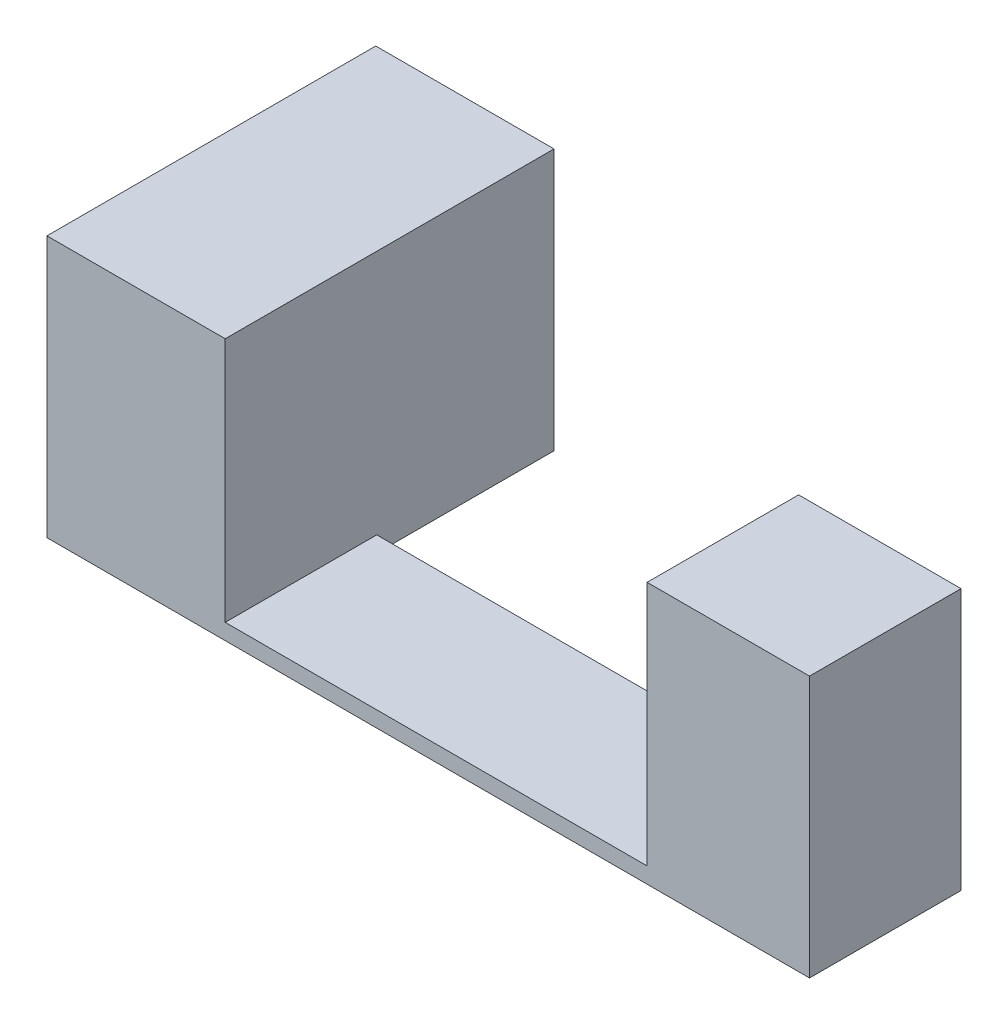
ISO-10303-21;
HEADER;
FILE_DESCRIPTION(('STEP AP214'),'2;1');
FILE_NAME('part.step','',(''),(''),'','','');
FILE_SCHEMA(('AUTOMOTIVE_DESIGN { 1 0 10303 214 1 1 1 1 }'));
ENDSEC;
DATA;
#1=APPLICATION_CONTEXT('core data for automotive mechanical design processes');
#2=APPLICATION_PROTOCOL_DEFINITION('international standard','automotive_design',2000,#1);
#3=PRODUCT_CONTEXT('',#1,'mechanical');
#4=PRODUCT('Part','Part','',(#3));
#5=PRODUCT_RELATED_PRODUCT_CATEGORY('part','',(#4));
#6=PRODUCT_DEFINITION_FORMATION('','',#4);
#7=PRODUCT_DEFINITION_CONTEXT('part definition',#1,'design');
#8=PRODUCT_DEFINITION('design','',#6,#7);
#9=PRODUCT_DEFINITION_SHAPE('','',#8);
#10=(LENGTH_UNIT() NAMED_UNIT(*) SI_UNIT(.MILLI.,.METRE.));
#11=(NAMED_UNIT(*) PLANE_ANGLE_UNIT() SI_UNIT($,.RADIAN.));
#12=(NAMED_UNIT(*) SI_UNIT($,.STERADIAN.) SOLID_ANGLE_UNIT());
#13=UNCERTAINTY_MEASURE_WITH_UNIT(LENGTH_MEASURE(1.E-05),#10,'distance_accuracy_value','');
#14=(GEOMETRIC_REPRESENTATION_CONTEXT(3) GLOBAL_UNCERTAINTY_ASSIGNED_CONTEXT((#13)) GLOBAL_UNIT_ASSIGNED_CONTEXT((#10,
#11,#12)) REPRESENTATION_CONTEXT('',''));
#15=CARTESIAN_POINT('',(0.,0.,0.));
#16=DIRECTION('',(0.,0.,1.));
#17=DIRECTION('',(1.,0.,0.));
#18=AXIS2_PLACEMENT_3D('',#15,#16,#17);
#19=CARTESIAN_POINT('',(0.,10.3971508975367,0.));
#20=DIRECTION('',(0.,-1.,0.));
#21=DIRECTION('',(0.,0.,-1.));
#22=AXIS2_PLACEMENT_3D('',#19,#20,#21);
#23=PLANE('',#22);
#24=DIRECTION('',(0.,0.,1.));
#25=VECTOR('',#24,1.);
#26=CARTESIAN_POINT('',(-25.4359590061108,10.3971508975367,0.));
#27=LINE('',#26,#25);
#28=CARTESIAN_POINT('',(-25.4359590061108,10.3971508975367,138.884868203981));
#29=VERTEX_POINT('',#28);
#30=CARTESIAN_POINT('',(-25.4359590061108,10.3971508975367,142.709868203979));
#31=VERTEX_POINT('',#30);
#32=EDGE_CURVE('E11',#29,#31,#27,.T.);
#33=ORIENTED_EDGE('',*,*,#32,.F.);
#34=DIRECTION('',(1.,0.,0.));
#35=VECTOR('',#34,1.);
#36=CARTESIAN_POINT('',(0.,10.3971508975367,138.884868203981));
#37=LINE('',#36,#35);
#38=CARTESIAN_POINT('',(-36.0859590061108,10.3971508975367,138.884868203981));
#39=VERTEX_POINT('',#38);
#40=EDGE_CURVE('E139',#39,#29,#37,.T.);
#41=ORIENTED_EDGE('',*,*,#40,.F.);
#42=DIRECTION('',(0.,0.,-1.));
#43=VECTOR('',#42,1.);
#44=CARTESIAN_POINT('',(-36.0859590061108,10.3971508975367,0.));
#45=LINE('',#44,#43);
#46=CARTESIAN_POINT('',(-36.0859590061108,10.3971508975367,142.709868203979));
#47=VERTEX_POINT('',#46);
#48=EDGE_CURVE('E115',#47,#39,#45,.T.);
#49=ORIENTED_EDGE('',*,*,#48,.F.);
#50=DIRECTION('',(1.,0.,0.));
#51=VECTOR('',#50,1.);
#52=CARTESIAN_POINT('',(0.,10.3971508975367,142.709868203979));
#53=LINE('',#52,#51);
#54=EDGE_CURVE('E142',#47,#31,#53,.T.);
#55=ORIENTED_EDGE('',*,*,#54,.T.);
#56=EDGE_LOOP('',(#33,#41,#49,#55));
#57=FACE_BOUND('',#56,.T.);
#58=ADVANCED_FACE('F35',(#57),#23,.F.);
#59=CARTESIAN_POINT('',(-40.5859590061108,26.0385490990745,0.));
#60=DIRECTION('',(1.,0.,0.));
#61=DIRECTION('',(0.,0.,-1.));
#62=AXIS2_PLACEMENT_3D('',#59,#60,#61);
#63=PLANE('',#62);
#64=DIRECTION('',(0.,0.,1.));
#65=VECTOR('',#64,1.);
#66=CARTESIAN_POINT('',(-40.5859590061108,9.99715089753672,0.));
#67=LINE('',#66,#65);
#68=CARTESIAN_POINT('',(-40.5859590061108,9.99715089753672,134.409868203979));
#69=VERTEX_POINT('',#68);
#70=CARTESIAN_POINT('',(-40.5859590061108,9.99715089753672,142.709868203979));
#71=VERTEX_POINT('',#70);
#72=EDGE_CURVE('E152',#69,#71,#67,.T.);
#73=ORIENTED_EDGE('',*,*,#72,.T.);
#74=DIRECTION('',(0.,-1.,0.));
#75=VECTOR('',#74,1.);
#76=CARTESIAN_POINT('',(-40.5859590061108,26.0385490990745,142.709868203979));
#77=LINE('',#76,#75);
#78=CARTESIAN_POINT('',(-40.5859590061108,16.5971508975367,142.709868203979));
#79=VERTEX_POINT('',#78);
#80=EDGE_CURVE('E155',#79,#71,#77,.T.);
#81=ORIENTED_EDGE('',*,*,#80,.F.);
#82=DIRECTION('',(0.,0.,-1.));
#83=VECTOR('',#82,1.);
#84=CARTESIAN_POINT('',(-40.5859590061108,16.5971508975367,0.));
#85=LINE('',#84,#83);
#86=CARTESIAN_POINT('',(-40.5859590061108,16.5971508975367,134.409868203979));
#87=VERTEX_POINT('',#86);
#88=EDGE_CURVE('E157',#79,#87,#85,.T.);
#89=ORIENTED_EDGE('',*,*,#88,.T.);
#90=DIRECTION('',(0.,-1.,0.));
#91=VECTOR('',#90,1.);
#92=CARTESIAN_POINT('',(-40.5859590061108,26.0385490990745,134.409868203979));
#93=LINE('',#92,#91);
#94=EDGE_CURVE('E168',#87,#69,#93,.T.);
#95=ORIENTED_EDGE('',*,*,#94,.T.);
#96=EDGE_LOOP('',(#73,#81,#89,#95));
#97=FACE_BOUND('',#96,.T.);
#98=ADVANCED_FACE('F37',(#97),#63,.F.);
#99=CARTESIAN_POINT('',(0.,26.0385490990745,142.709868203979));
#100=DIRECTION('',(0.,0.,-1.));
#101=DIRECTION('',(-1.,0.,0.));
#102=AXIS2_PLACEMENT_3D('',#99,#100,#101);
#103=PLANE('',#102);
#104=DIRECTION('',(0.,-1.,0.));
#105=VECTOR('',#104,1.);
#106=CARTESIAN_POINT('',(-21.3359590061108,10.3971508975367,142.709868203979));
#107=LINE('',#106,#105);
#108=CARTESIAN_POINT('',(-21.3359590061108,16.5971508975367,142.709868203979));
#109=VERTEX_POINT('',#108);
#110=CARTESIAN_POINT('',(-21.3359590061108,9.99715089753672,142.709868203979));
#111=VERTEX_POINT('',#110);
#112=EDGE_CURVE('E103',#109,#111,#107,.T.);
#113=ORIENTED_EDGE('',*,*,#112,.F.);
#114=DIRECTION('',(-1.,0.,0.));
#115=VECTOR('',#114,1.);
#116=CARTESIAN_POINT('',(0.,16.5971508975367,142.709868203979));
#117=LINE('',#116,#115);
#118=CARTESIAN_POINT('',(-25.4359590061108,16.5971508975367,142.709868203979));
#119=VERTEX_POINT('',#118);
#120=EDGE_CURVE('E107',#109,#119,#117,.T.);
#121=ORIENTED_EDGE('',*,*,#120,.T.);
#122=DIRECTION('',(0.,-1.,0.));
#123=VECTOR('',#122,1.);
#124=CARTESIAN_POINT('',(-25.4359590061108,26.0385490990745,142.709868203979));
#125=LINE('',#124,#123);
#126=EDGE_CURVE('E137',#119,#31,#125,.T.);
#127=ORIENTED_EDGE('',*,*,#126,.T.);
#128=ORIENTED_EDGE('',*,*,#54,.F.);
#129=DIRECTION('',(0.,-1.,0.));
#130=VECTOR('',#129,1.);
#131=CARTESIAN_POINT('',(-36.0859590061108,26.0385490990745,142.709868203979));
#132=LINE('',#131,#130);
#133=CARTESIAN_POINT('',(-36.0859590061108,16.5971508975367,142.709868203979));
#134=VERTEX_POINT('',#133);
#135=EDGE_CURVE('E170',#134,#47,#132,.T.);
#136=ORIENTED_EDGE('',*,*,#135,.F.);
#137=DIRECTION('',(-1.,0.,0.));
#138=VECTOR('',#137,1.);
#139=CARTESIAN_POINT('',(0.,16.5971508975367,142.709868203979));
#140=LINE('',#139,#138);
#141=EDGE_CURVE('E50',#134,#79,#140,.T.);
#142=ORIENTED_EDGE('',*,*,#141,.T.);
#143=ORIENTED_EDGE('',*,*,#80,.T.);
#144=DIRECTION('',(1.,0.,0.));
#145=VECTOR('',#144,1.);
#146=CARTESIAN_POINT('',(0.,9.99715089753672,142.709868203979));
#147=LINE('',#146,#145);
#148=EDGE_CURVE('E110',#71,#111,#147,.T.);
#149=ORIENTED_EDGE('',*,*,#148,.T.);
#150=EDGE_LOOP('',(#113,#121,#127,#128,#136,#142,#143,#149));
#151=FACE_BOUND('',#150,.T.);
#152=ADVANCED_FACE('F105',(#151),#103,.F.);
#153=CARTESIAN_POINT('',(-36.0859590061108,26.0385490990745,0.));
#154=DIRECTION('',(1.,0.,0.));
#155=DIRECTION('',(0.,0.,-1.));
#156=AXIS2_PLACEMENT_3D('',#153,#154,#155);
#157=PLANE('',#156);
#158=DIRECTION('',(0.,-1.,0.));
#159=VECTOR('',#158,1.);
#160=CARTESIAN_POINT('',(-36.0859590061108,10.3971508975367,138.884868203981));
#161=LINE('',#160,#159);
#162=CARTESIAN_POINT('',(-36.0859590061108,9.99715089753672,138.884868203981));
#163=VERTEX_POINT('',#162);
#164=EDGE_CURVE('E144',#39,#163,#161,.T.);
#165=ORIENTED_EDGE('',*,*,#164,.T.);
#166=DIRECTION('',(0.,0.,1.));
#167=VECTOR('',#166,1.);
#168=CARTESIAN_POINT('',(-36.0859590061108,9.99715089753672,0.));
#169=LINE('',#168,#167);
#170=CARTESIAN_POINT('',(-36.0859590061108,9.99715089753672,134.409868203979));
#171=VERTEX_POINT('',#170);
#172=EDGE_CURVE('E164',#171,#163,#169,.T.);
#173=ORIENTED_EDGE('',*,*,#172,.F.);
#174=DIRECTION('',(0.,-1.,0.));
#175=VECTOR('',#174,1.);
#176=CARTESIAN_POINT('',(-36.0859590061108,26.0385490990745,134.409868203979));
#177=LINE('',#176,#175);
#178=CARTESIAN_POINT('',(-36.0859590061108,16.5971508975367,134.409868203979));
#179=VERTEX_POINT('',#178);
#180=EDGE_CURVE('E173',#179,#171,#177,.T.);
#181=ORIENTED_EDGE('',*,*,#180,.F.);
#182=DIRECTION('',(0.,0.,-1.));
#183=VECTOR('',#182,1.);
#184=CARTESIAN_POINT('',(-36.0859590061108,16.5971508975367,0.));
#185=LINE('',#184,#183);
#186=EDGE_CURVE('E153',#134,#179,#185,.T.);
#187=ORIENTED_EDGE('',*,*,#186,.F.);
#188=ORIENTED_EDGE('',*,*,#135,.T.);
#189=ORIENTED_EDGE('',*,*,#48,.T.);
#190=EDGE_LOOP('',(#165,#173,#181,#187,#188,#189));
#191=FACE_BOUND('',#190,.T.);
#192=ADVANCED_FACE('F187',(#191),#157,.T.);
#193=CARTESIAN_POINT('',(0.,26.0385490990745,134.409868203979));
#194=DIRECTION('',(0.,0.,-1.));
#195=DIRECTION('',(-1.,0.,0.));
#196=AXIS2_PLACEMENT_3D('',#193,#194,#195);
#197=PLANE('',#196);
#198=DIRECTION('',(1.,0.,0.));
#199=VECTOR('',#198,1.);
#200=CARTESIAN_POINT('',(0.,9.99715089753672,134.409868203979));
#201=LINE('',#200,#199);
#202=EDGE_CURVE('E161',#69,#171,#201,.T.);
#203=ORIENTED_EDGE('',*,*,#202,.F.);
#204=ORIENTED_EDGE('',*,*,#94,.F.);
#205=DIRECTION('',(-1.,0.,0.));
#206=VECTOR('',#205,1.);
#207=CARTESIAN_POINT('',(0.,16.5971508975367,134.409868203979));
#208=LINE('',#207,#206);
#209=EDGE_CURVE('E43',#179,#87,#208,.T.);
#210=ORIENTED_EDGE('',*,*,#209,.F.);
#211=ORIENTED_EDGE('',*,*,#180,.T.);
#212=EDGE_LOOP('',(#203,#204,#210,#211));
#213=FACE_BOUND('',#212,.T.);
#214=ADVANCED_FACE('F183',(#213),#197,.T.);
#215=CARTESIAN_POINT('',(0.,9.99715089753672,0.));
#216=DIRECTION('',(0.,-1.,0.));
#217=DIRECTION('',(0.,0.,-1.));
#218=AXIS2_PLACEMENT_3D('',#215,#216,#217);
#219=PLANE('',#218);
#220=DIRECTION('',(0.,0.,1.));
#221=VECTOR('',#220,1.);
#222=CARTESIAN_POINT('',(-21.3359590061108,9.99715089753672,0.));
#223=LINE('',#222,#221);
#224=CARTESIAN_POINT('',(-21.3359590061108,9.99715089753672,138.884868203981));
#225=VERTEX_POINT('',#224);
#226=EDGE_CURVE('E132',#225,#111,#223,.T.);
#227=ORIENTED_EDGE('',*,*,#226,.T.);
#228=ORIENTED_EDGE('',*,*,#148,.F.);
#229=ORIENTED_EDGE('',*,*,#72,.F.);
#230=ORIENTED_EDGE('',*,*,#202,.T.);
#231=ORIENTED_EDGE('',*,*,#172,.T.);
#232=DIRECTION('',(1.,0.,0.));
#233=VECTOR('',#232,1.);
#234=CARTESIAN_POINT('',(0.,9.99715089753672,138.884868203981));
#235=LINE('',#234,#233);
#236=EDGE_CURVE('E129',#163,#225,#235,.T.);
#237=ORIENTED_EDGE('',*,*,#236,.T.);
#238=EDGE_LOOP('',(#227,#228,#229,#230,#231,#237));
#239=FACE_BOUND('',#238,.T.);
#240=ADVANCED_FACE('F182',(#239),#219,.T.);
#241=CARTESIAN_POINT('',(-71.3359590061109,16.5971508975367,116.65986820398));
#242=DIRECTION('',(0.,-1.,0.));
#243=DIRECTION('',(0.,0.,-1.));
#244=AXIS2_PLACEMENT_3D('',#241,#242,#243);
#245=PLANE('',#244);
#246=ORIENTED_EDGE('',*,*,#141,.F.);
#247=ORIENTED_EDGE('',*,*,#186,.T.);
#248=ORIENTED_EDGE('',*,*,#209,.T.);
#249=ORIENTED_EDGE('',*,*,#88,.F.);
#250=EDGE_LOOP('',(#246,#247,#248,#249));
#251=FACE_BOUND('',#250,.T.);
#252=ADVANCED_FACE('F199',(#251),#245,.F.);
#253=CARTESIAN_POINT('',(-21.3359590061108,10.3971508975367,0.));
#254=DIRECTION('',(1.,0.,0.));
#255=DIRECTION('',(0.,0.,-1.));
#256=AXIS2_PLACEMENT_3D('',#253,#254,#255);
#257=PLANE('',#256);
#258=ORIENTED_EDGE('',*,*,#226,.F.);
#259=DIRECTION('',(0.,-1.,0.));
#260=VECTOR('',#259,1.);
#261=CARTESIAN_POINT('',(-21.3359590061108,10.3971508975367,138.884868203981));
#262=LINE('',#261,#260);
#263=CARTESIAN_POINT('',(-21.3359590061108,16.5971508975367,138.884868203981));
#264=VERTEX_POINT('',#263);
#265=EDGE_CURVE('E116',#264,#225,#262,.T.);
#266=ORIENTED_EDGE('',*,*,#265,.F.);
#267=DIRECTION('',(0.,0.,-1.));
#268=VECTOR('',#267,1.);
#269=CARTESIAN_POINT('',(-21.3359590061108,16.5971508975367,0.));
#270=LINE('',#269,#268);
#271=EDGE_CURVE('E121',#109,#264,#270,.T.);
#272=ORIENTED_EDGE('',*,*,#271,.F.);
#273=ORIENTED_EDGE('',*,*,#112,.T.);
#274=EDGE_LOOP('',(#258,#266,#272,#273));
#275=FACE_BOUND('',#274,.T.);
#276=ADVANCED_FACE('F127',(#275),#257,.T.);
#277=CARTESIAN_POINT('',(0.,10.3971508975367,138.884868203981));
#278=DIRECTION('',(0.,0.,-1.));
#279=DIRECTION('',(-1.,0.,0.));
#280=AXIS2_PLACEMENT_3D('',#277,#278,#279);
#281=PLANE('',#280);
#282=ORIENTED_EDGE('',*,*,#265,.T.);
#283=ORIENTED_EDGE('',*,*,#236,.F.);
#284=ORIENTED_EDGE('',*,*,#164,.F.);
#285=ORIENTED_EDGE('',*,*,#40,.T.);
#286=DIRECTION('',(0.,-1.,0.));
#287=VECTOR('',#286,1.);
#288=CARTESIAN_POINT('',(-25.4359590061108,26.0385490990745,138.884868203981));
#289=LINE('',#288,#287);
#290=CARTESIAN_POINT('',(-25.4359590061108,16.5971508975367,138.884868203981));
#291=VERTEX_POINT('',#290);
#292=EDGE_CURVE('E125',#291,#29,#289,.T.);
#293=ORIENTED_EDGE('',*,*,#292,.F.);
#294=DIRECTION('',(-1.,0.,0.));
#295=VECTOR('',#294,1.);
#296=CARTESIAN_POINT('',(0.,16.5971508975367,138.884868203981));
#297=LINE('',#296,#295);
#298=EDGE_CURVE('E130',#264,#291,#297,.T.);
#299=ORIENTED_EDGE('',*,*,#298,.F.);
#300=EDGE_LOOP('',(#282,#283,#284,#285,#293,#299));
#301=FACE_BOUND('',#300,.T.);
#302=ADVANCED_FACE('F189',(#301),#281,.T.);
#303=CARTESIAN_POINT('',(-25.4359590061108,26.0385490990745,0.));
#304=DIRECTION('',(1.,0.,0.));
#305=DIRECTION('',(0.,0.,-1.));
#306=AXIS2_PLACEMENT_3D('',#303,#304,#305);
#307=PLANE('',#306);
#308=ORIENTED_EDGE('',*,*,#292,.T.);
#309=ORIENTED_EDGE('',*,*,#32,.T.);
#310=ORIENTED_EDGE('',*,*,#126,.F.);
#311=DIRECTION('',(0.,0.,-1.));
#312=VECTOR('',#311,1.);
#313=CARTESIAN_POINT('',(-25.4359590061108,16.5971508975367,0.));
#314=LINE('',#313,#312);
#315=EDGE_CURVE('E124',#119,#291,#314,.T.);
#316=ORIENTED_EDGE('',*,*,#315,.T.);
#317=EDGE_LOOP('',(#308,#309,#310,#316));
#318=FACE_BOUND('',#317,.T.);
#319=ADVANCED_FACE('F192',(#318),#307,.F.);
#320=CARTESIAN_POINT('',(-71.3359590061109,16.5971508975367,116.65986820398));
#321=DIRECTION('',(0.,-1.,0.));
#322=DIRECTION('',(0.,0.,-1.));
#323=AXIS2_PLACEMENT_3D('',#320,#321,#322);
#324=PLANE('',#323);
#325=ORIENTED_EDGE('',*,*,#298,.T.);
#326=ORIENTED_EDGE('',*,*,#315,.F.);
#327=ORIENTED_EDGE('',*,*,#120,.F.);
#328=ORIENTED_EDGE('',*,*,#271,.T.);
#329=EDGE_LOOP('',(#325,#326,#327,#328));
#330=FACE_BOUND('',#329,.T.);
#331=ADVANCED_FACE('F120',(#330),#324,.F.);
#332=CLOSED_SHELL('',(#58,#98,#152,#192,#214,#240,#252,#276,#302,#319,#331));
#333=MANIFOLD_SOLID_BREP('B2',#332);
#334=ADVANCED_BREP_SHAPE_REPRESENTATION('',(#18,#333),#14);
#335=SHAPE_DEFINITION_REPRESENTATION(#9,#334);
ENDSEC;
END-ISO-10303-21;
